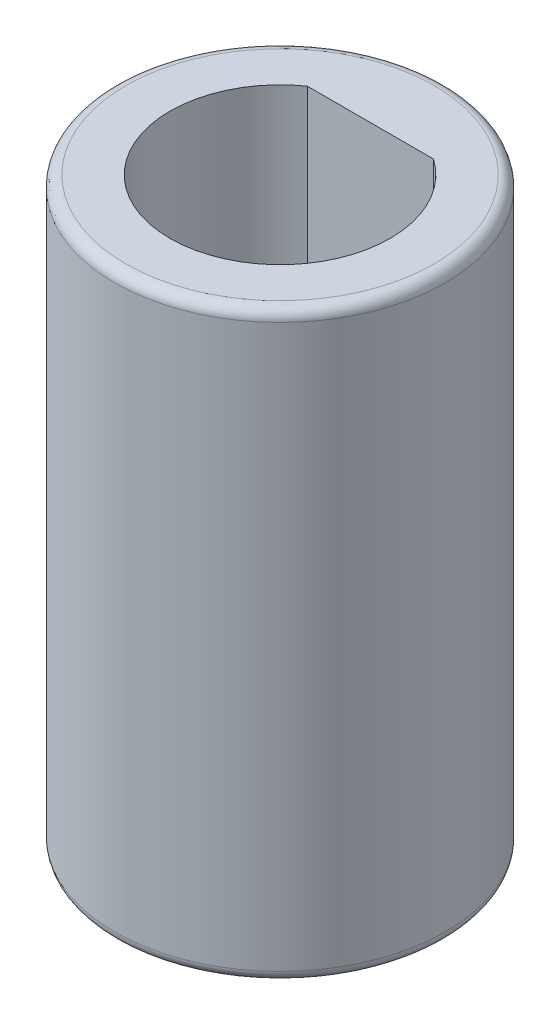
ISO-10303-21;
HEADER;
FILE_DESCRIPTION(('STEP AP214'),'2;1');
FILE_NAME('part.step','',(''),(''),'','','');
FILE_SCHEMA(('AUTOMOTIVE_DESIGN { 1 0 10303 214 1 1 1 1 }'));
ENDSEC;
DATA;
#1=APPLICATION_CONTEXT('core data for automotive mechanical design processes');
#2=APPLICATION_PROTOCOL_DEFINITION('international standard','automotive_design',2000,#1);
#3=PRODUCT_CONTEXT('',#1,'mechanical');
#4=PRODUCT('Part','Part','',(#3));
#5=PRODUCT_RELATED_PRODUCT_CATEGORY('part','',(#4));
#6=PRODUCT_DEFINITION_FORMATION('','',#4);
#7=PRODUCT_DEFINITION_CONTEXT('part definition',#1,'design');
#8=PRODUCT_DEFINITION('design','',#6,#7);
#9=PRODUCT_DEFINITION_SHAPE('','',#8);
#10=(LENGTH_UNIT() NAMED_UNIT(*) SI_UNIT(.MILLI.,.METRE.));
#11=(NAMED_UNIT(*) PLANE_ANGLE_UNIT() SI_UNIT($,.RADIAN.));
#12=(NAMED_UNIT(*) SI_UNIT($,.STERADIAN.) SOLID_ANGLE_UNIT());
#13=UNCERTAINTY_MEASURE_WITH_UNIT(LENGTH_MEASURE(1.E-05),#10,'distance_accuracy_value','');
#14=(GEOMETRIC_REPRESENTATION_CONTEXT(3) GLOBAL_UNCERTAINTY_ASSIGNED_CONTEXT((#13)) GLOBAL_UNIT_ASSIGNED_CONTEXT((#10,
#11,#12)) REPRESENTATION_CONTEXT('',''));
#15=CARTESIAN_POINT('',(0.,0.,0.));
#16=DIRECTION('',(0.,0.,1.));
#17=DIRECTION('',(1.,0.,0.));
#18=AXIS2_PLACEMENT_3D('',#15,#16,#17);
#19=CARTESIAN_POINT('',(0.,-0.00100000000000013,0.));
#20=DIRECTION('',(0.,1.,0.));
#21=DIRECTION('',(0.,0.,1.));
#22=AXIS2_PLACEMENT_3D('',#19,#20,#21);
#23=CYLINDRICAL_SURFACE('',#22,1.);
#24=DIRECTION('',(0.,1.,0.));
#25=VECTOR('',#24,1.);
#26=CARTESIAN_POINT('',(0.572363520850167,-0.00100000000000013,-0.82));
#27=LINE('',#26,#25);
#28=CARTESIAN_POINT('',(0.572363520850167,1.85,-0.82));
#29=VERTEX_POINT('',#28);
#30=CARTESIAN_POINT('',(0.572363520850167,5.3,-0.82));
#31=VERTEX_POINT('',#30);
#32=EDGE_CURVE('E80',#29,#31,#27,.T.);
#33=ORIENTED_EDGE('',*,*,#32,.F.);
#34=CARTESIAN_POINT('',(0.,1.85,0.));
#35=DIRECTION('',(0.,-1.,0.));
#36=DIRECTION('',(0.,0.,-1.));
#37=AXIS2_PLACEMENT_3D('',#34,#35,#36);
#38=CIRCLE('',#37,1.);
#39=CARTESIAN_POINT('',(-0.572363520850167,1.85,-0.82));
#40=VERTEX_POINT('',#39);
#41=EDGE_CURVE('E47',#29,#40,#38,.T.);
#42=ORIENTED_EDGE('',*,*,#41,.T.);
#43=DIRECTION('',(0.,1.,0.));
#44=VECTOR('',#43,1.);
#45=CARTESIAN_POINT('',(-0.572363520850167,-0.00100000000000013,-0.82));
#46=LINE('',#45,#44);
#47=CARTESIAN_POINT('',(-0.572363520850167,5.3,-0.82));
#48=VERTEX_POINT('',#47);
#49=EDGE_CURVE('E74',#40,#48,#46,.T.);
#50=ORIENTED_EDGE('',*,*,#49,.T.);
#51=CARTESIAN_POINT('',(0.,5.3,0.));
#52=DIRECTION('',(0.,1.,0.));
#53=DIRECTION('',(0.,0.,1.));
#54=AXIS2_PLACEMENT_3D('',#51,#52,#53);
#55=CIRCLE('',#54,1.);
#56=EDGE_CURVE('E77',#48,#31,#55,.T.);
#57=ORIENTED_EDGE('',*,*,#56,.T.);
#58=EDGE_LOOP('',(#33,#42,#50,#57));
#59=FACE_BOUND('',#58,.T.);
#60=ADVANCED_FACE('F34',(#59),#23,.F.);
#61=CARTESIAN_POINT('',(-0.572363520850167,-0.00100000000000013,-0.82));
#62=DIRECTION('',(0.,0.,-1.));
#63=DIRECTION('',(-1.,0.,0.));
#64=AXIS2_PLACEMENT_3D('',#61,#62,#63);
#65=PLANE('',#64);
#66=ORIENTED_EDGE('',*,*,#49,.F.);
#67=DIRECTION('',(1.,0.,0.));
#68=VECTOR('',#67,1.);
#69=CARTESIAN_POINT('',(0.572363520850167,1.85,-0.82));
#70=LINE('',#69,#68);
#71=EDGE_CURVE('E11',#40,#29,#70,.T.);
#72=ORIENTED_EDGE('',*,*,#71,.T.);
#73=ORIENTED_EDGE('',*,*,#32,.T.);
#74=DIRECTION('',(-1.,0.,0.));
#75=VECTOR('',#74,1.);
#76=CARTESIAN_POINT('',(-0.572363520850167,5.3,-0.82));
#77=LINE('',#76,#75);
#78=EDGE_CURVE('E82',#31,#48,#77,.T.);
#79=ORIENTED_EDGE('',*,*,#78,.T.);
#80=EDGE_LOOP('',(#66,#72,#73,#79));
#81=FACE_BOUND('',#80,.T.);
#82=ADVANCED_FACE('F83',(#81),#65,.F.);
#83=CARTESIAN_POINT('',(0.,5.3,0.));
#84=DIRECTION('',(0.,-1.,0.));
#85=DIRECTION('',(0.,0.,-1.));
#86=AXIS2_PLACEMENT_3D('',#83,#84,#85);
#87=CYLINDRICAL_SURFACE('',#86,1.5);
#88=CARTESIAN_POINT('',(0.,0.1,0.));
#89=DIRECTION('',(0.,1.,0.));
#90=DIRECTION('',(0.,0.,1.));
#91=AXIS2_PLACEMENT_3D('',#88,#89,#90);
#92=CIRCLE('',#91,1.5);
#93=CARTESIAN_POINT('',(0.,0.1,1.5));
#94=VERTEX_POINT('',#93);
#95=EDGE_CURVE('E104',#94,#94,#92,.T.);
#96=ORIENTED_EDGE('',*,*,#95,.T.);
#97=EDGE_LOOP('',(#96));
#98=FACE_BOUND('',#97,.T.);
#99=CARTESIAN_POINT('',(0.,5.2,0.));
#100=DIRECTION('',(0.,1.,0.));
#101=DIRECTION('',(0.,0.,1.));
#102=AXIS2_PLACEMENT_3D('',#99,#100,#101);
#103=CIRCLE('',#102,1.5);
#104=CARTESIAN_POINT('',(0.,5.2,1.5));
#105=VERTEX_POINT('',#104);
#106=EDGE_CURVE('E101',#105,#105,#103,.F.);
#107=ORIENTED_EDGE('',*,*,#106,.T.);
#108=EDGE_LOOP('',(#107));
#109=FACE_BOUND('',#108,.T.);
#110=ADVANCED_FACE('F134',(#98,#109),#87,.T.);
#111=CARTESIAN_POINT('',(0.,5.3,0.));
#112=DIRECTION('',(0.,1.,0.));
#113=DIRECTION('',(0.,0.,1.));
#114=AXIS2_PLACEMENT_3D('',#111,#112,#113);
#115=PLANE('',#114);
#116=CARTESIAN_POINT('',(0.,5.3,0.));
#117=DIRECTION('',(0.,1.,0.));
#118=DIRECTION('',(0.,0.,1.));
#119=AXIS2_PLACEMENT_3D('',#116,#117,#118);
#120=CIRCLE('',#119,1.4);
#121=CARTESIAN_POINT('',(0.,5.3,1.4));
#122=VERTEX_POINT('',#121);
#123=EDGE_CURVE('E107',#122,#122,#120,.T.);
#124=ORIENTED_EDGE('',*,*,#123,.T.);
#125=EDGE_LOOP('',(#124));
#126=FACE_BOUND('',#125,.T.);
#127=ORIENTED_EDGE('',*,*,#56,.F.);
#128=ORIENTED_EDGE('',*,*,#78,.F.);
#129=EDGE_LOOP('',(#127,#128));
#130=FACE_BOUND('',#129,.T.);
#131=ADVANCED_FACE('F86',(#126,#130),#115,.T.);
#132=CARTESIAN_POINT('',(0.,0.,0.));
#133=DIRECTION('',(0.,1.,0.));
#134=DIRECTION('',(0.,0.,1.));
#135=AXIS2_PLACEMENT_3D('',#132,#133,#134);
#136=PLANE('',#135);
#137=CARTESIAN_POINT('',(0.,0.,0.));
#138=DIRECTION('',(0.,1.,0.));
#139=DIRECTION('',(0.,0.,1.));
#140=AXIS2_PLACEMENT_3D('',#137,#138,#139);
#141=CIRCLE('',#140,1.2);
#142=CARTESIAN_POINT('',(0.,0.,1.2));
#143=VERTEX_POINT('',#142);
#144=EDGE_CURVE('E98',#143,#143,#141,.T.);
#145=ORIENTED_EDGE('',*,*,#144,.T.);
#146=EDGE_LOOP('',(#145));
#147=FACE_BOUND('',#146,.T.);
#148=CARTESIAN_POINT('',(0.,0.,0.));
#149=DIRECTION('',(0.,1.,0.));
#150=DIRECTION('',(0.,0.,1.));
#151=AXIS2_PLACEMENT_3D('',#148,#149,#150);
#152=CIRCLE('',#151,1.4);
#153=CARTESIAN_POINT('',(0.,0.,1.4));
#154=VERTEX_POINT('',#153);
#155=EDGE_CURVE('E95',#154,#154,#152,.F.);
#156=ORIENTED_EDGE('',*,*,#155,.T.);
#157=EDGE_LOOP('',(#156));
#158=FACE_BOUND('',#157,.T.);
#159=ADVANCED_FACE('F138',(#147,#158),#136,.F.);
#160=CARTESIAN_POINT('',(0.,1.75,0.));
#161=DIRECTION('',(0.,-1.,0.));
#162=DIRECTION('',(0.,0.,-1.));
#163=AXIS2_PLACEMENT_3D('',#160,#161,#162);
#164=PLANE('',#163);
#165=CARTESIAN_POINT('',(0.,1.75,0.));
#166=DIRECTION('',(0.,-1.,0.));
#167=DIRECTION('',(0.,0.,-1.));
#168=AXIS2_PLACEMENT_3D('',#165,#166,#167);
#169=CIRCLE('',#168,1.1);
#170=CARTESIAN_POINT('',(-0.602992537267254,1.75,-0.919999999999999));
#171=VERTEX_POINT('',#170);
#172=CARTESIAN_POINT('',(0.602992537267254,1.75,-0.919999999999999));
#173=VERTEX_POINT('',#172);
#174=EDGE_CURVE('E89',#171,#173,#169,.T.);
#175=ORIENTED_EDGE('',*,*,#174,.T.);
#176=DIRECTION('',(-1.,0.,0.));
#177=VECTOR('',#176,1.);
#178=CARTESIAN_POINT('',(-0.572363520850167,1.75,-0.919999999999999));
#179=LINE('',#178,#177);
#180=EDGE_CURVE('E110',#173,#171,#179,.T.);
#181=ORIENTED_EDGE('',*,*,#180,.T.);
#182=EDGE_LOOP('',(#175,#181));
#183=FACE_BOUND('',#182,.T.);
#184=ADVANCED_FACE('F141',(#183),#164,.T.);
#185=CARTESIAN_POINT('',(0.,1.75,0.));
#186=DIRECTION('',(0.,-1.,0.));
#187=DIRECTION('',(0.,0.,-1.));
#188=AXIS2_PLACEMENT_3D('',#185,#186,#187);
#189=CYLINDRICAL_SURFACE('',#188,1.1);
#190=CARTESIAN_POINT('',(0.,0.1,0.));
#191=DIRECTION('',(0.,1.,0.));
#192=DIRECTION('',(0.,0.,1.));
#193=AXIS2_PLACEMENT_3D('',#190,#191,#192);
#194=CIRCLE('',#193,1.1);
#195=CARTESIAN_POINT('',(0.,0.1,1.1));
#196=VERTEX_POINT('',#195);
#197=EDGE_CURVE('E79',#196,#196,#194,.F.);
#198=ORIENTED_EDGE('',*,*,#197,.T.);
#199=EDGE_LOOP('',(#198));
#200=FACE_BOUND('',#199,.T.);
#201=EDGE_CURVE('E87',#173,#171,#169,.T.);
#202=ORIENTED_EDGE('',*,*,#201,.F.);
#203=ORIENTED_EDGE('',*,*,#174,.F.);
#204=EDGE_LOOP('',(#202,#203));
#205=FACE_BOUND('',#204,.T.);
#206=ADVANCED_FACE('F132',(#200,#205),#189,.F.);
#207=CARTESIAN_POINT('',(0.,0.1,0.));
#208=DIRECTION('',(0.,1.,0.));
#209=DIRECTION('',(0.,0.,1.));
#210=AXIS2_PLACEMENT_3D('',#207,#208,#209);
#211=TOROIDAL_SURFACE('',#210,1.2,0.1);
#212=ORIENTED_EDGE('',*,*,#144,.F.);
#213=EDGE_LOOP('',(#212));
#214=FACE_BOUND('',#213,.T.);
#215=ORIENTED_EDGE('',*,*,#197,.F.);
#216=EDGE_LOOP('',(#215));
#217=FACE_BOUND('',#216,.T.);
#218=ADVANCED_FACE('F128',(#214,#217),#211,.T.);
#219=CARTESIAN_POINT('',(0.,0.1,0.));
#220=DIRECTION('',(0.,1.,0.));
#221=DIRECTION('',(0.,0.,1.));
#222=AXIS2_PLACEMENT_3D('',#219,#220,#221);
#223=TOROIDAL_SURFACE('',#222,1.4,0.1);
#224=ORIENTED_EDGE('',*,*,#155,.F.);
#225=EDGE_LOOP('',(#224));
#226=FACE_BOUND('',#225,.T.);
#227=ORIENTED_EDGE('',*,*,#95,.F.);
#228=EDGE_LOOP('',(#227));
#229=FACE_BOUND('',#228,.T.);
#230=ADVANCED_FACE('F124',(#226,#229),#223,.T.);
#231=CARTESIAN_POINT('',(0.,5.2,0.));
#232=DIRECTION('',(0.,1.,0.));
#233=DIRECTION('',(0.,0.,1.));
#234=AXIS2_PLACEMENT_3D('',#231,#232,#233);
#235=TOROIDAL_SURFACE('',#234,1.4,0.1);
#236=ORIENTED_EDGE('',*,*,#106,.F.);
#237=EDGE_LOOP('',(#236));
#238=FACE_BOUND('',#237,.T.);
#239=ORIENTED_EDGE('',*,*,#123,.F.);
#240=EDGE_LOOP('',(#239));
#241=FACE_BOUND('',#240,.T.);
#242=ADVANCED_FACE('F120',(#238,#241),#235,.T.);
#243=CARTESIAN_POINT('',(0.,1.75,-0.919999999999999));
#244=DIRECTION('',(0.,-0.707106781186544,0.707106781186551));
#245=DIRECTION('',(1.,0.,0.));
#246=AXIS2_PLACEMENT_3D('',#243,#244,#245);
#247=PLANE('',#246);
#248=CARTESIAN_POINT('',(0.602992537267315,1.75,-0.919999999999959));
#249=CARTESIAN_POINT('',(0.598014751585142,1.76668611777165,-0.903313882228327));
#250=CARTESIAN_POINT('',(0.592973441614384,1.78336250711096,-0.886637492889037));
#251=CARTESIAN_POINT('',(0.582763769563282,1.81669584045776,-0.853304159542249));
#252=CARTESIAN_POINT('',(0.577595407395024,1.83335278445179,-0.836647215548214));
#253=CARTESIAN_POINT('',(0.572363520850266,1.85000000000001,-0.819999999999985));
#254=B_SPLINE_CURVE_WITH_KNOTS('',3,(#248,#249,#250,#251,#252,#253),.UNSPECIFIED.,.F.,.F.,(4,2,
4),(0.,0.0723503183207641,0.14470068670606),.UNSPECIFIED.);
#255=EDGE_CURVE('E112',#29,#173,#254,.F.);
#256=ORIENTED_EDGE('',*,*,#255,.F.);
#257=ORIENTED_EDGE('',*,*,#71,.F.);
#258=CARTESIAN_POINT('',(-0.572363520850167,1.85,-0.82));
#259=CARTESIAN_POINT('',(-0.577595407394967,1.83335278445178,-0.836647215548219));
#260=CARTESIAN_POINT('',(-0.582763769563257,1.81669584045775,-0.853304159542249));
#261=CARTESIAN_POINT('',(-0.592973441614408,1.78336250711096,-0.886637492889036));
#262=CARTESIAN_POINT('',(-0.598014751585183,1.76668611777167,-0.90331388222833));
#263=CARTESIAN_POINT('',(-0.602992537267364,1.75000000000003,-0.919999999999972));
#264=B_SPLINE_CURVE_WITH_KNOTS('',3,(#258,#259,#260,#261,#262,#263),.UNSPECIFIED.,.F.,.F.,(4,2,
4),(0.,0.0723503683852961,0.14470068670606),.UNSPECIFIED.);
#265=EDGE_CURVE('E39',#171,#40,#264,.F.);
#266=ORIENTED_EDGE('',*,*,#265,.F.);
#267=ORIENTED_EDGE('',*,*,#180,.F.);
#268=EDGE_LOOP('',(#256,#257,#266,#267));
#269=FACE_BOUND('',#268,.T.);
#270=ADVANCED_FACE('F36',(#269),#247,.T.);
#271=CARTESIAN_POINT('',(0.,1.75,0.));
#272=DIRECTION('',(0.,-1.,0.));
#273=DIRECTION('',(0.,0.,-1.));
#274=AXIS2_PLACEMENT_3D('',#271,#272,#273);
#275=CONICAL_SURFACE('',#274,1.1,0.785398163397444);
#276=ORIENTED_EDGE('',*,*,#265,.T.);
#277=ORIENTED_EDGE('',*,*,#41,.F.);
#278=ORIENTED_EDGE('',*,*,#255,.T.);
#279=ORIENTED_EDGE('',*,*,#201,.T.);
#280=EDGE_LOOP('',(#276,#277,#278,#279));
#281=FACE_BOUND('',#280,.T.);
#282=ADVANCED_FACE('F116',(#281),#275,.F.);
#283=CLOSED_SHELL('',(#60,#82,#110,#131,#159,#184,#206,#218,#230,#242,#270,#282));
#284=MANIFOLD_SOLID_BREP('B2',#283);
#285=ADVANCED_BREP_SHAPE_REPRESENTATION('',(#18,#284),#14);
#286=SHAPE_DEFINITION_REPRESENTATION(#9,#285);
ENDSEC;
END-ISO-10303-21;
